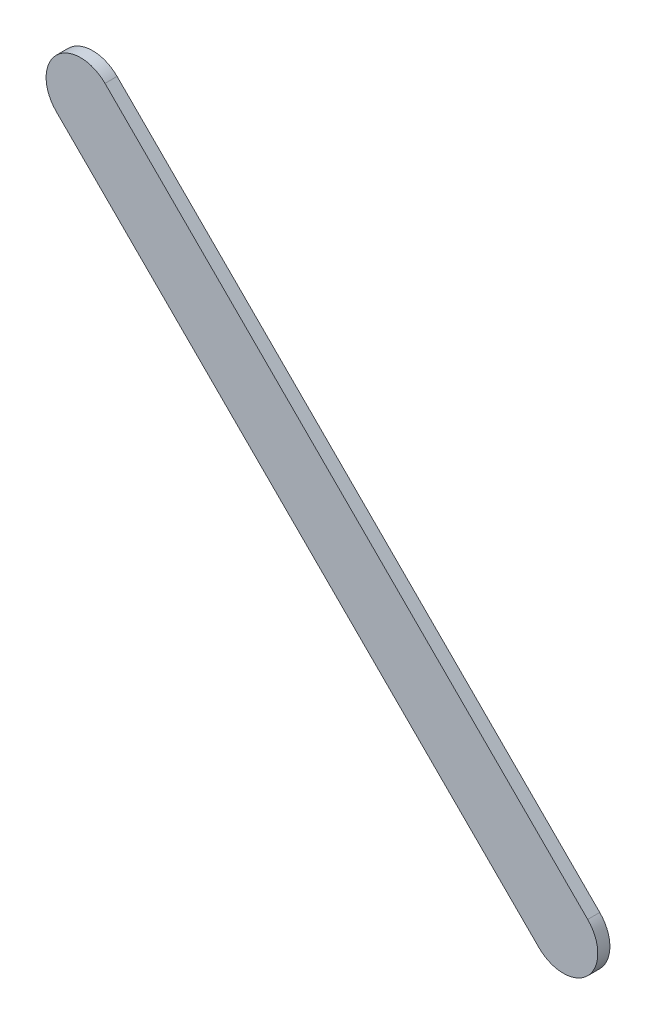
ISO-10303-21;
HEADER;
FILE_DESCRIPTION(('STEP AP214'),'2;1');
FILE_NAME('part.step','',(''),(''),'','','');
FILE_SCHEMA(('AUTOMOTIVE_DESIGN { 1 0 10303 214 1 1 1 1 }'));
ENDSEC;
DATA;
#1=APPLICATION_CONTEXT('core data for automotive mechanical design processes');
#2=APPLICATION_PROTOCOL_DEFINITION('international standard','automotive_design',2000,#1);
#3=PRODUCT_CONTEXT('',#1,'mechanical');
#4=PRODUCT('Part','Part','',(#3));
#5=PRODUCT_RELATED_PRODUCT_CATEGORY('part','',(#4));
#6=PRODUCT_DEFINITION_FORMATION('','',#4);
#7=PRODUCT_DEFINITION_CONTEXT('part definition',#1,'design');
#8=PRODUCT_DEFINITION('design','',#6,#7);
#9=PRODUCT_DEFINITION_SHAPE('','',#8);
#10=(LENGTH_UNIT() NAMED_UNIT(*) SI_UNIT(.MILLI.,.METRE.));
#11=(NAMED_UNIT(*) PLANE_ANGLE_UNIT() SI_UNIT($,.RADIAN.));
#12=(NAMED_UNIT(*) SI_UNIT($,.STERADIAN.) SOLID_ANGLE_UNIT());
#13=UNCERTAINTY_MEASURE_WITH_UNIT(LENGTH_MEASURE(1.E-05),#10,'distance_accuracy_value','');
#14=(GEOMETRIC_REPRESENTATION_CONTEXT(3) GLOBAL_UNCERTAINTY_ASSIGNED_CONTEXT((#13)) GLOBAL_UNIT_ASSIGNED_CONTEXT((#10,
#11,#12)) REPRESENTATION_CONTEXT('',''));
#15=CARTESIAN_POINT('',(0.,0.,0.));
#16=DIRECTION('',(0.,0.,1.));
#17=DIRECTION('',(1.,0.,0.));
#18=AXIS2_PLACEMENT_3D('',#15,#16,#17);
#19=CARTESIAN_POINT('',(82.157107,-120.02071,1.635));
#20=DIRECTION('',(0.,0.,1.));
#21=DIRECTION('',(1.,0.,0.));
#22=AXIS2_PLACEMENT_3D('',#19,#20,#21);
#23=PLANE('',#22);
#24=DIRECTION('',(0.707106781186548,-0.707106781186548,0.));
#25=VECTOR('',#24,1.);
#26=CARTESIAN_POINT('',(82.157107,-120.02071,1.635));
#27=LINE('',#26,#25);
#28=CARTESIAN_POINT('',(82.157107,-120.02071,1.635));
#29=VERTEX_POINT('',#28);
#30=CARTESIAN_POINT('',(83.557107,-121.42071,1.635));
#31=VERTEX_POINT('',#30);
#32=EDGE_CURVE('E94',#29,#31,#27,.T.);
#33=ORIENTED_EDGE('',*,*,#32,.T.);
#34=CARTESIAN_POINT('',(83.6278175,-121.3499995,1.635));
#35=DIRECTION('',(0.,0.,1.));
#36=DIRECTION('',(-0.707106781186048,-0.707106781187048,0.));
#37=AXIS2_PLACEMENT_3D('',#34,#35,#36);
#38=CIRCLE('',#37,0.09999974810218);
#39=CARTESIAN_POINT('',(83.698528,-121.279289,1.635));
#40=VERTEX_POINT('',#39);
#41=EDGE_CURVE('E74',#31,#40,#38,.T.);
#42=ORIENTED_EDGE('',*,*,#41,.T.);
#43=DIRECTION('',(-0.707106781186548,0.707106781186548,0.));
#44=VECTOR('',#43,1.);
#45=CARTESIAN_POINT('',(83.698528,-121.279289,1.635));
#46=LINE('',#45,#44);
#47=CARTESIAN_POINT('',(82.298528,-119.879289,1.635));
#48=VERTEX_POINT('',#47);
#49=EDGE_CURVE('E88',#40,#48,#46,.T.);
#50=ORIENTED_EDGE('',*,*,#49,.T.);
#51=CARTESIAN_POINT('',(82.2278175,-119.9499995,1.635));
#52=DIRECTION('',(0.,0.,1.));
#53=DIRECTION('',(0.707106781187048,0.707106781186048,0.));
#54=AXIS2_PLACEMENT_3D('',#51,#52,#53);
#55=CIRCLE('',#54,0.09999974810218);
#56=EDGE_CURVE('E11',#48,#29,#55,.T.);
#57=ORIENTED_EDGE('',*,*,#56,.T.);
#58=EDGE_LOOP('',(#33,#42,#50,#57));
#59=FACE_BOUND('',#58,.T.);
#60=ADVANCED_FACE('F17',(#59),#23,.T.);
#61=CARTESIAN_POINT('',(82.157107,-120.02071,1.6));
#62=DIRECTION('',(0.,0.,1.));
#63=DIRECTION('',(1.,0.,0.));
#64=AXIS2_PLACEMENT_3D('',#61,#62,#63);
#65=PLANE('',#64);
#66=CARTESIAN_POINT('',(82.2278175,-119.9499995,1.6));
#67=DIRECTION('',(0.,0.,1.));
#68=DIRECTION('',(0.707106781187048,0.707106781186048,0.));
#69=AXIS2_PLACEMENT_3D('',#66,#67,#68);
#70=CIRCLE('',#69,0.09999974810218);
#71=CARTESIAN_POINT('',(82.298528,-119.879289,1.6));
#72=VERTEX_POINT('',#71);
#73=CARTESIAN_POINT('',(82.157107,-120.02071,1.6));
#74=VERTEX_POINT('',#73);
#75=EDGE_CURVE('E21',#72,#74,#70,.T.);
#76=ORIENTED_EDGE('',*,*,#75,.F.);
#77=DIRECTION('',(-0.707106781186548,0.707106781186548,0.));
#78=VECTOR('',#77,1.);
#79=CARTESIAN_POINT('',(83.698528,-121.279289,1.6));
#80=LINE('',#79,#78);
#81=CARTESIAN_POINT('',(83.698528,-121.279289,1.6));
#82=VERTEX_POINT('',#81);
#83=EDGE_CURVE('E59',#82,#72,#80,.T.);
#84=ORIENTED_EDGE('',*,*,#83,.F.);
#85=CARTESIAN_POINT('',(83.6278175,-121.3499995,1.6));
#86=DIRECTION('',(0.,0.,1.));
#87=DIRECTION('',(-0.707106781186048,-0.707106781187048,0.));
#88=AXIS2_PLACEMENT_3D('',#85,#86,#87);
#89=CIRCLE('',#88,0.09999974810218);
#90=CARTESIAN_POINT('',(83.557107,-121.42071,1.6));
#91=VERTEX_POINT('',#90);
#92=EDGE_CURVE('E96',#91,#82,#89,.T.);
#93=ORIENTED_EDGE('',*,*,#92,.F.);
#94=DIRECTION('',(0.707106781186548,-0.707106781186548,0.));
#95=VECTOR('',#94,1.);
#96=CARTESIAN_POINT('',(82.157107,-120.02071,1.6));
#97=LINE('',#96,#95);
#98=EDGE_CURVE('E93',#74,#91,#97,.T.);
#99=ORIENTED_EDGE('',*,*,#98,.F.);
#100=EDGE_LOOP('',(#76,#84,#93,#99));
#101=FACE_BOUND('',#100,.T.);
#102=ADVANCED_FACE('F19',(#101),#65,.F.);
#103=CARTESIAN_POINT('',(82.2278175,-119.9499995,1.6));
#104=DIRECTION('',(0.,0.,-1.));
#105=DIRECTION('',(0.707106781187048,0.707106781186048,0.));
#106=AXIS2_PLACEMENT_3D('',#103,#104,#105);
#107=CYLINDRICAL_SURFACE('',#106,0.09999974810218);
#108=ORIENTED_EDGE('',*,*,#75,.T.);
#109=DIRECTION('',(0.,0.,1.));
#110=VECTOR('',#109,1.);
#111=CARTESIAN_POINT('',(82.157107,-120.02071,1.6));
#112=LINE('',#111,#110);
#113=EDGE_CURVE('E83',#74,#29,#112,.T.);
#114=ORIENTED_EDGE('',*,*,#113,.T.);
#115=ORIENTED_EDGE('',*,*,#56,.F.);
#116=DIRECTION('',(0.,0.,1.));
#117=VECTOR('',#116,1.);
#118=CARTESIAN_POINT('',(82.298528,-119.879289,1.6));
#119=LINE('',#118,#117);
#120=EDGE_CURVE('E86',#72,#48,#119,.T.);
#121=ORIENTED_EDGE('',*,*,#120,.F.);
#122=EDGE_LOOP('',(#108,#114,#115,#121));
#123=FACE_BOUND('',#122,.T.);
#124=ADVANCED_FACE('F82',(#123),#107,.T.);
#125=CARTESIAN_POINT('',(83.698528,-121.279289,1.6));
#126=DIRECTION('',(-0.707106781186548,-0.707106781186548,0.));
#127=DIRECTION('',(-0.707106781186548,0.707106781186548,0.));
#128=AXIS2_PLACEMENT_3D('',#125,#126,#127);
#129=PLANE('',#128);
#130=ORIENTED_EDGE('',*,*,#83,.T.);
#131=ORIENTED_EDGE('',*,*,#120,.T.);
#132=ORIENTED_EDGE('',*,*,#49,.F.);
#133=DIRECTION('',(0.,0.,1.));
#134=VECTOR('',#133,1.);
#135=CARTESIAN_POINT('',(83.698528,-121.279289,1.6));
#136=LINE('',#135,#134);
#137=EDGE_CURVE('E113',#82,#40,#136,.T.);
#138=ORIENTED_EDGE('',*,*,#137,.F.);
#139=EDGE_LOOP('',(#130,#131,#132,#138));
#140=FACE_BOUND('',#139,.T.);
#141=ADVANCED_FACE('F123',(#140),#129,.F.);
#142=CARTESIAN_POINT('',(83.6278175,-121.3499995,1.6));
#143=DIRECTION('',(0.,0.,-1.));
#144=DIRECTION('',(-0.707106781186048,-0.707106781187048,0.));
#145=AXIS2_PLACEMENT_3D('',#142,#143,#144);
#146=CYLINDRICAL_SURFACE('',#145,0.09999974810218);
#147=ORIENTED_EDGE('',*,*,#92,.T.);
#148=ORIENTED_EDGE('',*,*,#137,.T.);
#149=ORIENTED_EDGE('',*,*,#41,.F.);
#150=DIRECTION('',(0.,0.,1.));
#151=VECTOR('',#150,1.);
#152=CARTESIAN_POINT('',(83.557107,-121.42071,1.6));
#153=LINE('',#152,#151);
#154=EDGE_CURVE('E100',#91,#31,#153,.T.);
#155=ORIENTED_EDGE('',*,*,#154,.F.);
#156=EDGE_LOOP('',(#147,#148,#149,#155));
#157=FACE_BOUND('',#156,.T.);
#158=ADVANCED_FACE('F124',(#157),#146,.T.);
#159=CARTESIAN_POINT('',(82.157107,-120.02071,1.6));
#160=DIRECTION('',(0.707106781186548,0.707106781186548,0.));
#161=DIRECTION('',(0.,0.,-1.));
#162=AXIS2_PLACEMENT_3D('',#159,#160,#161);
#163=PLANE('',#162);
#164=ORIENTED_EDGE('',*,*,#98,.T.);
#165=ORIENTED_EDGE('',*,*,#154,.T.);
#166=ORIENTED_EDGE('',*,*,#32,.F.);
#167=ORIENTED_EDGE('',*,*,#113,.F.);
#168=EDGE_LOOP('',(#164,#165,#166,#167));
#169=FACE_BOUND('',#168,.T.);
#170=ADVANCED_FACE('F91',(#169),#163,.F.);
#171=CLOSED_SHELL('',(#60,#102,#124,#141,#158,#170));
#172=MANIFOLD_SOLID_BREP('B1',#171);
#173=ADVANCED_BREP_SHAPE_REPRESENTATION('',(#18,#172),#14);
#174=SHAPE_DEFINITION_REPRESENTATION(#9,#173);
ENDSEC;
END-ISO-10303-21;
